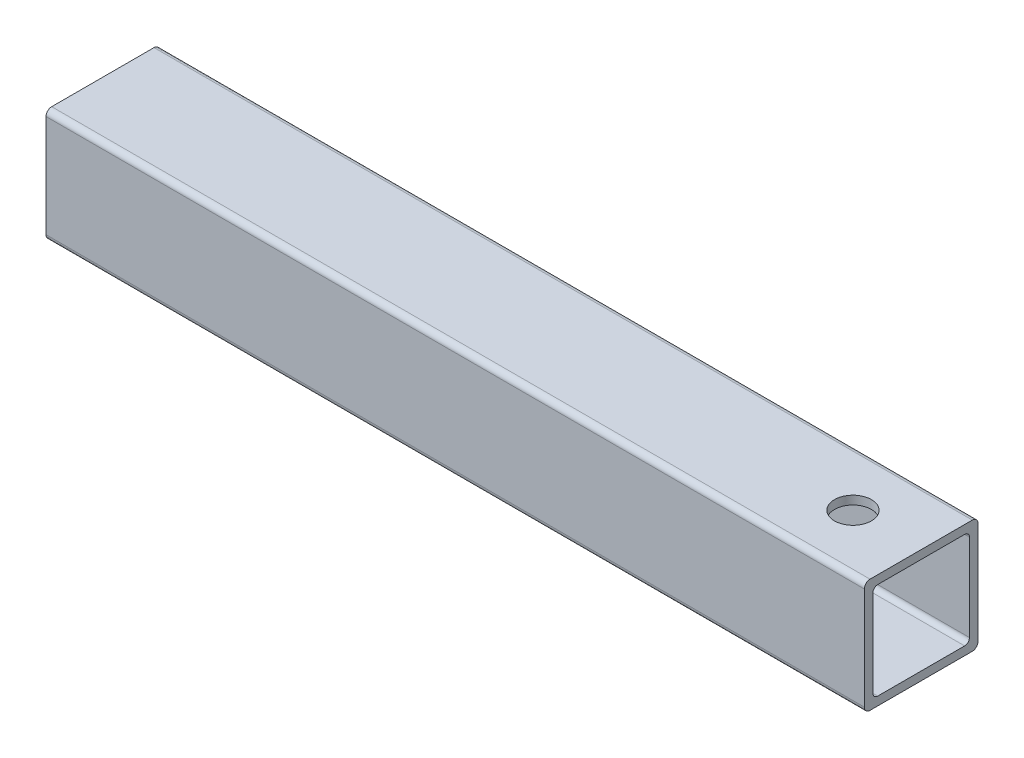
ISO-10303-21;
HEADER;
FILE_DESCRIPTION(('STEP AP214'),'2;1');
FILE_NAME('part.step','',(''),(''),'','','');
FILE_SCHEMA(('AUTOMOTIVE_DESIGN { 1 0 10303 214 1 1 1 1 }'));
ENDSEC;
DATA;
#1=APPLICATION_CONTEXT('core data for automotive mechanical design processes');
#2=APPLICATION_PROTOCOL_DEFINITION('international standard','automotive_design',2000,#1);
#3=PRODUCT_CONTEXT('',#1,'mechanical');
#4=PRODUCT('Part','Part','',(#3));
#5=PRODUCT_RELATED_PRODUCT_CATEGORY('part','',(#4));
#6=PRODUCT_DEFINITION_FORMATION('','',#4);
#7=PRODUCT_DEFINITION_CONTEXT('part definition',#1,'design');
#8=PRODUCT_DEFINITION('design','',#6,#7);
#9=PRODUCT_DEFINITION_SHAPE('','',#8);
#10=(LENGTH_UNIT() NAMED_UNIT(*) SI_UNIT(.MILLI.,.METRE.));
#11=(NAMED_UNIT(*) PLANE_ANGLE_UNIT() SI_UNIT($,.RADIAN.));
#12=(NAMED_UNIT(*) SI_UNIT($,.STERADIAN.) SOLID_ANGLE_UNIT());
#13=UNCERTAINTY_MEASURE_WITH_UNIT(LENGTH_MEASURE(1.E-05),#10,'distance_accuracy_value','');
#14=(GEOMETRIC_REPRESENTATION_CONTEXT(3) GLOBAL_UNCERTAINTY_ASSIGNED_CONTEXT((#13)) GLOBAL_UNIT_ASSIGNED_CONTEXT((#10,
#11,#12)) REPRESENTATION_CONTEXT('',''));
#15=CARTESIAN_POINT('',(0.,0.,0.));
#16=DIRECTION('',(0.,0.,1.));
#17=DIRECTION('',(1.,0.,0.));
#18=AXIS2_PLACEMENT_3D('',#15,#16,#17);
#19=CARTESIAN_POINT('',(457.2,28.575,-28.575));
#20=DIRECTION('',(-1.,0.,0.));
#21=DIRECTION('',(0.,0.,1.));
#22=AXIS2_PLACEMENT_3D('',#19,#20,#21);
#23=CYLINDRICAL_SURFACE('',#22,3.175);
#24=CARTESIAN_POINT('',(0.,28.575,-28.575));
#25=DIRECTION('',(1.,0.,0.));
#26=DIRECTION('',(0.,0.,-1.));
#27=AXIS2_PLACEMENT_3D('',#24,#25,#26);
#28=CIRCLE('',#27,3.175);
#29=CARTESIAN_POINT('',(0.,28.575,-31.75));
#30=VERTEX_POINT('',#29);
#31=CARTESIAN_POINT('',(0.,31.75,-28.575));
#32=VERTEX_POINT('',#31);
#33=EDGE_CURVE('E253',#30,#32,#28,.T.);
#34=ORIENTED_EDGE('',*,*,#33,.T.);
#35=DIRECTION('',(-1.,0.,0.));
#36=VECTOR('',#35,1.);
#37=CARTESIAN_POINT('',(457.2,31.75,-28.575));
#38=LINE('',#37,#36);
#39=CARTESIAN_POINT('',(457.2,31.75,-28.575));
#40=VERTEX_POINT('',#39);
#41=EDGE_CURVE('E12',#40,#32,#38,.T.);
#42=ORIENTED_EDGE('',*,*,#41,.F.);
#43=CARTESIAN_POINT('',(457.2,28.575,-28.575));
#44=DIRECTION('',(1.,0.,0.));
#45=DIRECTION('',(0.,0.,-1.));
#46=AXIS2_PLACEMENT_3D('',#43,#44,#45);
#47=CIRCLE('',#46,3.175);
#48=CARTESIAN_POINT('',(457.2,28.575,-31.75));
#49=VERTEX_POINT('',#48);
#50=EDGE_CURVE('E359',#49,#40,#47,.T.);
#51=ORIENTED_EDGE('',*,*,#50,.F.);
#52=DIRECTION('',(-1.,0.,0.));
#53=VECTOR('',#52,1.);
#54=CARTESIAN_POINT('',(457.2,28.575,-31.75));
#55=LINE('',#54,#53);
#56=EDGE_CURVE('E276',#49,#30,#55,.T.);
#57=ORIENTED_EDGE('',*,*,#56,.T.);
#58=EDGE_LOOP('',(#34,#42,#51,#57));
#59=FACE_BOUND('',#58,.T.);
#60=ADVANCED_FACE('F67',(#59),#23,.T.);
#61=CARTESIAN_POINT('',(457.2,31.75,-28.575));
#62=DIRECTION('',(0.,-1.,0.));
#63=DIRECTION('',(0.,0.,-1.));
#64=AXIS2_PLACEMENT_3D('',#61,#62,#63);
#65=PLANE('',#64);
#66=CARTESIAN_POINT('',(419.1,31.75,0.));
#67=DIRECTION('',(0.,1.,0.));
#68=DIRECTION('',(0.,0.,1.));
#69=AXIS2_PLACEMENT_3D('',#66,#67,#68);
#70=CIRCLE('',#69,10.3251);
#71=CARTESIAN_POINT('',(419.1,31.75,10.3251));
#72=VERTEX_POINT('',#71);
#73=EDGE_CURVE('E561',#72,#72,#70,.T.);
#74=ORIENTED_EDGE('',*,*,#73,.F.);
#75=EDGE_LOOP('',(#74));
#76=FACE_BOUND('',#75,.T.);
#77=DIRECTION('',(0.,0.,1.));
#78=VECTOR('',#77,1.);
#79=CARTESIAN_POINT('',(0.,31.75,-28.575));
#80=LINE('',#79,#78);
#81=CARTESIAN_POINT('',(0.,31.75,28.575));
#82=VERTEX_POINT('',#81);
#83=EDGE_CURVE('E257',#32,#82,#80,.T.);
#84=ORIENTED_EDGE('',*,*,#83,.T.);
#85=DIRECTION('',(-1.,0.,0.));
#86=VECTOR('',#85,1.);
#87=CARTESIAN_POINT('',(457.2,31.75,28.575));
#88=LINE('',#87,#86);
#89=CARTESIAN_POINT('',(457.2,31.75,28.575));
#90=VERTEX_POINT('',#89);
#91=EDGE_CURVE('E78',#90,#82,#88,.T.);
#92=ORIENTED_EDGE('',*,*,#91,.F.);
#93=DIRECTION('',(0.,0.,1.));
#94=VECTOR('',#93,1.);
#95=CARTESIAN_POINT('',(457.2,31.75,-28.575));
#96=LINE('',#95,#94);
#97=EDGE_CURVE('E362',#40,#90,#96,.T.);
#98=ORIENTED_EDGE('',*,*,#97,.F.);
#99=ORIENTED_EDGE('',*,*,#41,.T.);
#100=EDGE_LOOP('',(#84,#92,#98,#99));
#101=FACE_BOUND('',#100,.T.);
#102=ADVANCED_FACE('F401',(#76,#101),#65,.F.);
#103=CARTESIAN_POINT('',(457.2,28.575,28.575));
#104=DIRECTION('',(-1.,0.,0.));
#105=DIRECTION('',(0.,0.,1.));
#106=AXIS2_PLACEMENT_3D('',#103,#104,#105);
#107=CYLINDRICAL_SURFACE('',#106,3.175);
#108=CARTESIAN_POINT('',(0.,28.575,28.575));
#109=DIRECTION('',(1.,0.,0.));
#110=DIRECTION('',(0.,0.,-1.));
#111=AXIS2_PLACEMENT_3D('',#108,#109,#110);
#112=CIRCLE('',#111,3.175);
#113=CARTESIAN_POINT('',(0.,28.575,31.75));
#114=VERTEX_POINT('',#113);
#115=EDGE_CURVE('E260',#82,#114,#112,.T.);
#116=ORIENTED_EDGE('',*,*,#115,.T.);
#117=DIRECTION('',(-1.,0.,0.));
#118=VECTOR('',#117,1.);
#119=CARTESIAN_POINT('',(457.2,28.575,31.75));
#120=LINE('',#119,#118);
#121=CARTESIAN_POINT('',(457.2,28.575,31.75));
#122=VERTEX_POINT('',#121);
#123=EDGE_CURVE('E287',#122,#114,#120,.T.);
#124=ORIENTED_EDGE('',*,*,#123,.F.);
#125=CARTESIAN_POINT('',(457.2,28.575,28.575));
#126=DIRECTION('',(1.,0.,0.));
#127=DIRECTION('',(0.,0.,-1.));
#128=AXIS2_PLACEMENT_3D('',#125,#126,#127);
#129=CIRCLE('',#128,3.175);
#130=EDGE_CURVE('E365',#90,#122,#129,.T.);
#131=ORIENTED_EDGE('',*,*,#130,.F.);
#132=ORIENTED_EDGE('',*,*,#91,.T.);
#133=EDGE_LOOP('',(#116,#124,#131,#132));
#134=FACE_BOUND('',#133,.T.);
#135=ADVANCED_FACE('F406',(#134),#107,.T.);
#136=CARTESIAN_POINT('',(457.2,28.575,31.75));
#137=DIRECTION('',(0.,0.,-1.));
#138=DIRECTION('',(-1.,0.,0.));
#139=AXIS2_PLACEMENT_3D('',#136,#137,#138);
#140=PLANE('',#139);
#141=DIRECTION('',(0.,-1.,0.));
#142=VECTOR('',#141,1.);
#143=CARTESIAN_POINT('',(0.,28.575,31.75));
#144=LINE('',#143,#142);
#145=CARTESIAN_POINT('',(0.,-28.575,31.75));
#146=VERTEX_POINT('',#145);
#147=EDGE_CURVE('E263',#114,#146,#144,.T.);
#148=ORIENTED_EDGE('',*,*,#147,.T.);
#149=DIRECTION('',(-1.,0.,0.));
#150=VECTOR('',#149,1.);
#151=CARTESIAN_POINT('',(457.2,-28.575,31.75));
#152=LINE('',#151,#150);
#153=CARTESIAN_POINT('',(457.2,-28.575,31.75));
#154=VERTEX_POINT('',#153);
#155=EDGE_CURVE('E283',#154,#146,#152,.T.);
#156=ORIENTED_EDGE('',*,*,#155,.F.);
#157=DIRECTION('',(0.,-1.,0.));
#158=VECTOR('',#157,1.);
#159=CARTESIAN_POINT('',(457.2,28.575,31.75));
#160=LINE('',#159,#158);
#161=EDGE_CURVE('E368',#122,#154,#160,.T.);
#162=ORIENTED_EDGE('',*,*,#161,.F.);
#163=ORIENTED_EDGE('',*,*,#123,.T.);
#164=EDGE_LOOP('',(#148,#156,#162,#163));
#165=FACE_BOUND('',#164,.T.);
#166=ADVANCED_FACE('F376',(#165),#140,.F.);
#167=CARTESIAN_POINT('',(457.2,-28.575,28.575));
#168=DIRECTION('',(-1.,0.,0.));
#169=DIRECTION('',(0.,0.,1.));
#170=AXIS2_PLACEMENT_3D('',#167,#168,#169);
#171=CYLINDRICAL_SURFACE('',#170,3.175);
#172=CARTESIAN_POINT('',(0.,-28.575,28.575));
#173=DIRECTION('',(1.,0.,0.));
#174=DIRECTION('',(0.,0.,-1.));
#175=AXIS2_PLACEMENT_3D('',#172,#173,#174);
#176=CIRCLE('',#175,3.175);
#177=CARTESIAN_POINT('',(0.,-31.75,28.575));
#178=VERTEX_POINT('',#177);
#179=EDGE_CURVE('E266',#146,#178,#176,.T.);
#180=ORIENTED_EDGE('',*,*,#179,.T.);
#181=DIRECTION('',(-1.,0.,0.));
#182=VECTOR('',#181,1.);
#183=CARTESIAN_POINT('',(457.2,-31.75,28.575));
#184=LINE('',#183,#182);
#185=CARTESIAN_POINT('',(457.2,-31.75,28.575));
#186=VERTEX_POINT('',#185);
#187=EDGE_CURVE('E209',#186,#178,#184,.T.);
#188=ORIENTED_EDGE('',*,*,#187,.F.);
#189=CARTESIAN_POINT('',(457.2,-28.575,28.575));
#190=DIRECTION('',(1.,0.,0.));
#191=DIRECTION('',(0.,0.,-1.));
#192=AXIS2_PLACEMENT_3D('',#189,#190,#191);
#193=CIRCLE('',#192,3.175);
#194=EDGE_CURVE('E198',#154,#186,#193,.T.);
#195=ORIENTED_EDGE('',*,*,#194,.F.);
#196=ORIENTED_EDGE('',*,*,#155,.T.);
#197=EDGE_LOOP('',(#180,#188,#195,#196));
#198=FACE_BOUND('',#197,.T.);
#199=ADVANCED_FACE('F380',(#198),#171,.T.);
#200=CARTESIAN_POINT('',(457.2,-31.75,-28.575));
#201=DIRECTION('',(0.,1.,0.));
#202=DIRECTION('',(0.,0.,1.));
#203=AXIS2_PLACEMENT_3D('',#200,#201,#202);
#204=PLANE('',#203);
#205=DIRECTION('',(0.,0.,-1.));
#206=VECTOR('',#205,1.);
#207=CARTESIAN_POINT('',(0.,-31.75,-28.575));
#208=LINE('',#207,#206);
#209=CARTESIAN_POINT('',(0.,-31.75,-28.575));
#210=VERTEX_POINT('',#209);
#211=EDGE_CURVE('E207',#178,#210,#208,.T.);
#212=ORIENTED_EDGE('',*,*,#211,.T.);
#213=DIRECTION('',(-1.,0.,0.));
#214=VECTOR('',#213,1.);
#215=CARTESIAN_POINT('',(457.2,-31.75,-28.575));
#216=LINE('',#215,#214);
#217=CARTESIAN_POINT('',(457.2,-31.75,-28.575));
#218=VERTEX_POINT('',#217);
#219=EDGE_CURVE('E204',#218,#210,#216,.T.);
#220=ORIENTED_EDGE('',*,*,#219,.F.);
#221=DIRECTION('',(0.,0.,-1.));
#222=VECTOR('',#221,1.);
#223=CARTESIAN_POINT('',(457.2,-31.75,-28.575));
#224=LINE('',#223,#222);
#225=EDGE_CURVE('E192',#186,#218,#224,.T.);
#226=ORIENTED_EDGE('',*,*,#225,.F.);
#227=ORIENTED_EDGE('',*,*,#187,.T.);
#228=EDGE_LOOP('',(#212,#220,#226,#227));
#229=FACE_BOUND('',#228,.T.);
#230=ADVANCED_FACE('F205',(#229),#204,.F.);
#231=CARTESIAN_POINT('',(457.2,-28.575,-28.575));
#232=DIRECTION('',(-1.,0.,0.));
#233=DIRECTION('',(0.,0.,1.));
#234=AXIS2_PLACEMENT_3D('',#231,#232,#233);
#235=CYLINDRICAL_SURFACE('',#234,3.175);
#236=CARTESIAN_POINT('',(0.,-28.575,-28.575));
#237=DIRECTION('',(1.,0.,0.));
#238=DIRECTION('',(0.,0.,1.));
#239=AXIS2_PLACEMENT_3D('',#236,#237,#238);
#240=CIRCLE('',#239,3.175);
#241=CARTESIAN_POINT('',(0.,-28.575,-31.75));
#242=VERTEX_POINT('',#241);
#243=EDGE_CURVE('E140',#210,#242,#240,.T.);
#244=ORIENTED_EDGE('',*,*,#243,.T.);
#245=DIRECTION('',(-1.,0.,0.));
#246=VECTOR('',#245,1.);
#247=CARTESIAN_POINT('',(457.2,-28.575,-31.75));
#248=LINE('',#247,#246);
#249=CARTESIAN_POINT('',(457.2,-28.575,-31.75));
#250=VERTEX_POINT('',#249);
#251=EDGE_CURVE('E210',#250,#242,#248,.T.);
#252=ORIENTED_EDGE('',*,*,#251,.F.);
#253=CARTESIAN_POINT('',(457.2,-28.575,-28.575));
#254=DIRECTION('',(1.,0.,0.));
#255=DIRECTION('',(0.,0.,1.));
#256=AXIS2_PLACEMENT_3D('',#253,#254,#255);
#257=CIRCLE('',#256,3.175);
#258=EDGE_CURVE('E196',#218,#250,#257,.T.);
#259=ORIENTED_EDGE('',*,*,#258,.F.);
#260=ORIENTED_EDGE('',*,*,#219,.T.);
#261=EDGE_LOOP('',(#244,#252,#259,#260));
#262=FACE_BOUND('',#261,.T.);
#263=ADVANCED_FACE('F212',(#262),#235,.T.);
#264=CARTESIAN_POINT('',(457.2,-24.27732,-24.27732));
#265=DIRECTION('',(-1.,0.,0.));
#266=DIRECTION('',(0.,0.,1.));
#267=AXIS2_PLACEMENT_3D('',#264,#265,#266);
#268=CYLINDRICAL_SURFACE('',#267,2.69748);
#269=CARTESIAN_POINT('',(0.,-24.27732,-24.27732));
#270=DIRECTION('',(1.,0.,0.));
#271=DIRECTION('',(0.,0.,1.));
#272=AXIS2_PLACEMENT_3D('',#269,#270,#271);
#273=CIRCLE('',#272,2.69748);
#274=CARTESIAN_POINT('',(0.,-26.9748,-24.27732));
#275=VERTEX_POINT('',#274);
#276=CARTESIAN_POINT('',(0.,-24.27732,-26.9748));
#277=VERTEX_POINT('',#276);
#278=EDGE_CURVE('E220',#275,#277,#273,.T.);
#279=ORIENTED_EDGE('',*,*,#278,.F.);
#280=DIRECTION('',(-1.,0.,0.));
#281=VECTOR('',#280,1.);
#282=CARTESIAN_POINT('',(457.2,-26.9748,-24.27732));
#283=LINE('',#282,#281);
#284=CARTESIAN_POINT('',(457.2,-26.9748,-24.27732));
#285=VERTEX_POINT('',#284);
#286=EDGE_CURVE('E71',#285,#275,#283,.T.);
#287=ORIENTED_EDGE('',*,*,#286,.F.);
#288=CARTESIAN_POINT('',(457.2,-24.27732,-24.27732));
#289=DIRECTION('',(1.,0.,0.));
#290=DIRECTION('',(0.,0.,1.));
#291=AXIS2_PLACEMENT_3D('',#288,#289,#290);
#292=CIRCLE('',#291,2.69748);
#293=CARTESIAN_POINT('',(457.2,-24.27732,-26.9748));
#294=VERTEX_POINT('',#293);
#295=EDGE_CURVE('E275',#285,#294,#292,.T.);
#296=ORIENTED_EDGE('',*,*,#295,.T.);
#297=DIRECTION('',(-1.,0.,0.));
#298=VECTOR('',#297,1.);
#299=CARTESIAN_POINT('',(457.2,-24.27732,-26.9748));
#300=LINE('',#299,#298);
#301=EDGE_CURVE('E216',#294,#277,#300,.T.);
#302=ORIENTED_EDGE('',*,*,#301,.T.);
#303=EDGE_LOOP('',(#279,#287,#296,#302));
#304=FACE_BOUND('',#303,.T.);
#305=ADVANCED_FACE('F69',(#304),#268,.F.);
#306=CARTESIAN_POINT('',(457.2,-26.9748,24.27732));
#307=DIRECTION('',(0.,1.,0.));
#308=DIRECTION('',(0.,0.,1.));
#309=AXIS2_PLACEMENT_3D('',#306,#307,#308);
#310=PLANE('',#309);
#311=DIRECTION('',(0.,0.,-1.));
#312=VECTOR('',#311,1.);
#313=CARTESIAN_POINT('',(0.,-26.9748,24.27732));
#314=LINE('',#313,#312);
#315=CARTESIAN_POINT('',(0.,-26.9748,24.27732));
#316=VERTEX_POINT('',#315);
#317=EDGE_CURVE('E224',#316,#275,#314,.T.);
#318=ORIENTED_EDGE('',*,*,#317,.F.);
#319=DIRECTION('',(-1.,0.,0.));
#320=VECTOR('',#319,1.);
#321=CARTESIAN_POINT('',(457.2,-26.9748,24.27732));
#322=LINE('',#321,#320);
#323=CARTESIAN_POINT('',(457.2,-26.9748,24.27732));
#324=VERTEX_POINT('',#323);
#325=EDGE_CURVE('E310',#324,#316,#322,.T.);
#326=ORIENTED_EDGE('',*,*,#325,.F.);
#327=DIRECTION('',(0.,0.,-1.));
#328=VECTOR('',#327,1.);
#329=CARTESIAN_POINT('',(457.2,-26.9748,24.27732));
#330=LINE('',#329,#328);
#331=EDGE_CURVE('E321',#324,#285,#330,.T.);
#332=ORIENTED_EDGE('',*,*,#331,.T.);
#333=ORIENTED_EDGE('',*,*,#286,.T.);
#334=EDGE_LOOP('',(#318,#326,#332,#333));
#335=FACE_BOUND('',#334,.T.);
#336=ADVANCED_FACE('F319',(#335),#310,.T.);
#337=CARTESIAN_POINT('',(457.2,-24.27732,24.27732));
#338=DIRECTION('',(-1.,0.,0.));
#339=DIRECTION('',(0.,0.,1.));
#340=AXIS2_PLACEMENT_3D('',#337,#338,#339);
#341=CYLINDRICAL_SURFACE('',#340,2.69748000000001);
#342=CARTESIAN_POINT('',(0.,-24.27732,24.27732));
#343=DIRECTION('',(1.,0.,0.));
#344=DIRECTION('',(0.,0.,-1.));
#345=AXIS2_PLACEMENT_3D('',#342,#343,#344);
#346=CIRCLE('',#345,2.69748000000001);
#347=CARTESIAN_POINT('',(0.,-24.27732,26.9748));
#348=VERTEX_POINT('',#347);
#349=EDGE_CURVE('E229',#348,#316,#346,.T.);
#350=ORIENTED_EDGE('',*,*,#349,.F.);
#351=DIRECTION('',(-1.,0.,0.));
#352=VECTOR('',#351,1.);
#353=CARTESIAN_POINT('',(457.2,-24.27732,26.9748));
#354=LINE('',#353,#352);
#355=CARTESIAN_POINT('',(457.2,-24.27732,26.9748));
#356=VERTEX_POINT('',#355);
#357=EDGE_CURVE('E308',#356,#348,#354,.T.);
#358=ORIENTED_EDGE('',*,*,#357,.F.);
#359=CARTESIAN_POINT('',(457.2,-24.27732,24.27732));
#360=DIRECTION('',(1.,0.,0.));
#361=DIRECTION('',(0.,0.,-1.));
#362=AXIS2_PLACEMENT_3D('',#359,#360,#361);
#363=CIRCLE('',#362,2.69748000000001);
#364=EDGE_CURVE('E329',#356,#324,#363,.T.);
#365=ORIENTED_EDGE('',*,*,#364,.T.);
#366=ORIENTED_EDGE('',*,*,#325,.T.);
#367=EDGE_LOOP('',(#350,#358,#365,#366));
#368=FACE_BOUND('',#367,.T.);
#369=ADVANCED_FACE('F327',(#368),#341,.F.);
#370=CARTESIAN_POINT('',(457.2,24.27732,26.9748));
#371=DIRECTION('',(0.,0.,-1.));
#372=DIRECTION('',(0.,1.,0.));
#373=AXIS2_PLACEMENT_3D('',#370,#371,#372);
#374=PLANE('',#373);
#375=DIRECTION('',(0.,-1.,0.));
#376=VECTOR('',#375,1.);
#377=CARTESIAN_POINT('',(0.,24.27732,26.9748));
#378=LINE('',#377,#376);
#379=CARTESIAN_POINT('',(0.,24.27732,26.9748));
#380=VERTEX_POINT('',#379);
#381=EDGE_CURVE('E233',#380,#348,#378,.T.);
#382=ORIENTED_EDGE('',*,*,#381,.F.);
#383=DIRECTION('',(-1.,0.,0.));
#384=VECTOR('',#383,1.);
#385=CARTESIAN_POINT('',(457.2,24.27732,26.9748));
#386=LINE('',#385,#384);
#387=CARTESIAN_POINT('',(457.2,24.27732,26.9748));
#388=VERTEX_POINT('',#387);
#389=EDGE_CURVE('E305',#388,#380,#386,.T.);
#390=ORIENTED_EDGE('',*,*,#389,.F.);
#391=DIRECTION('',(0.,-1.,0.));
#392=VECTOR('',#391,1.);
#393=CARTESIAN_POINT('',(457.2,24.27732,26.9748));
#394=LINE('',#393,#392);
#395=EDGE_CURVE('E335',#388,#356,#394,.T.);
#396=ORIENTED_EDGE('',*,*,#395,.T.);
#397=ORIENTED_EDGE('',*,*,#357,.T.);
#398=EDGE_LOOP('',(#382,#390,#396,#397));
#399=FACE_BOUND('',#398,.T.);
#400=ADVANCED_FACE('F339',(#399),#374,.T.);
#401=CARTESIAN_POINT('',(457.2,24.27732,24.27732));
#402=DIRECTION('',(-1.,0.,0.));
#403=DIRECTION('',(0.,0.,1.));
#404=AXIS2_PLACEMENT_3D('',#401,#402,#403);
#405=CYLINDRICAL_SURFACE('',#404,2.69748);
#406=CARTESIAN_POINT('',(0.,24.27732,24.27732));
#407=DIRECTION('',(1.,0.,0.));
#408=DIRECTION('',(0.,0.,1.));
#409=AXIS2_PLACEMENT_3D('',#406,#407,#408);
#410=CIRCLE('',#409,2.69748);
#411=CARTESIAN_POINT('',(0.,26.9748,24.27732));
#412=VERTEX_POINT('',#411);
#413=EDGE_CURVE('E237',#412,#380,#410,.T.);
#414=ORIENTED_EDGE('',*,*,#413,.F.);
#415=DIRECTION('',(-1.,0.,0.));
#416=VECTOR('',#415,1.);
#417=CARTESIAN_POINT('',(457.2,26.9748,24.27732));
#418=LINE('',#417,#416);
#419=CARTESIAN_POINT('',(457.2,26.9748,24.27732));
#420=VERTEX_POINT('',#419);
#421=EDGE_CURVE('E302',#420,#412,#418,.T.);
#422=ORIENTED_EDGE('',*,*,#421,.F.);
#423=CARTESIAN_POINT('',(457.2,24.27732,24.27732));
#424=DIRECTION('',(1.,0.,0.));
#425=DIRECTION('',(0.,0.,1.));
#426=AXIS2_PLACEMENT_3D('',#423,#424,#425);
#427=CIRCLE('',#426,2.69748);
#428=EDGE_CURVE('E341',#420,#388,#427,.T.);
#429=ORIENTED_EDGE('',*,*,#428,.T.);
#430=ORIENTED_EDGE('',*,*,#389,.T.);
#431=EDGE_LOOP('',(#414,#422,#429,#430));
#432=FACE_BOUND('',#431,.T.);
#433=ADVANCED_FACE('F417',(#432),#405,.F.);
#434=CARTESIAN_POINT('',(457.2,26.9748,24.27732));
#435=DIRECTION('',(0.,-1.,0.));
#436=DIRECTION('',(0.,0.,-1.));
#437=AXIS2_PLACEMENT_3D('',#434,#435,#436);
#438=PLANE('',#437);
#439=CARTESIAN_POINT('',(419.1,26.9748,0.));
#440=DIRECTION('',(0.,-1.,0.));
#441=DIRECTION('',(0.,0.,-1.));
#442=AXIS2_PLACEMENT_3D('',#439,#440,#441);
#443=CIRCLE('',#442,10.3251);
#444=CARTESIAN_POINT('',(419.1,26.9748,-10.3251));
#445=VERTEX_POINT('',#444);
#446=EDGE_CURVE('E225',#445,#445,#443,.F.);
#447=ORIENTED_EDGE('',*,*,#446,.T.);
#448=EDGE_LOOP('',(#447));
#449=FACE_BOUND('',#448,.T.);
#450=DIRECTION('',(0.,0.,1.));
#451=VECTOR('',#450,1.);
#452=CARTESIAN_POINT('',(0.,26.9748,24.27732));
#453=LINE('',#452,#451);
#454=CARTESIAN_POINT('',(0.,26.9748,-24.27732));
#455=VERTEX_POINT('',#454);
#456=EDGE_CURVE('E241',#455,#412,#453,.T.);
#457=ORIENTED_EDGE('',*,*,#456,.F.);
#458=DIRECTION('',(-1.,0.,0.));
#459=VECTOR('',#458,1.);
#460=CARTESIAN_POINT('',(457.2,26.9748,-24.27732));
#461=LINE('',#460,#459);
#462=CARTESIAN_POINT('',(457.2,26.9748,-24.27732));
#463=VERTEX_POINT('',#462);
#464=EDGE_CURVE('E299',#463,#455,#461,.T.);
#465=ORIENTED_EDGE('',*,*,#464,.F.);
#466=DIRECTION('',(0.,0.,1.));
#467=VECTOR('',#466,1.);
#468=CARTESIAN_POINT('',(457.2,26.9748,24.27732));
#469=LINE('',#468,#467);
#470=EDGE_CURVE('E344',#463,#420,#469,.T.);
#471=ORIENTED_EDGE('',*,*,#470,.T.);
#472=ORIENTED_EDGE('',*,*,#421,.T.);
#473=EDGE_LOOP('',(#457,#465,#471,#472));
#474=FACE_BOUND('',#473,.T.);
#475=ADVANCED_FACE('F413',(#449,#474),#438,.T.);
#476=CARTESIAN_POINT('',(457.2,24.27732,-24.27732));
#477=DIRECTION('',(-1.,0.,0.));
#478=DIRECTION('',(0.,0.,1.));
#479=AXIS2_PLACEMENT_3D('',#476,#477,#478);
#480=CYLINDRICAL_SURFACE('',#479,2.69748);
#481=CARTESIAN_POINT('',(0.,24.27732,-24.27732));
#482=DIRECTION('',(1.,0.,0.));
#483=DIRECTION('',(0.,0.,1.));
#484=AXIS2_PLACEMENT_3D('',#481,#482,#483);
#485=CIRCLE('',#484,2.69748);
#486=CARTESIAN_POINT('',(0.,24.27732,-26.9748));
#487=VERTEX_POINT('',#486);
#488=EDGE_CURVE('E245',#487,#455,#485,.T.);
#489=ORIENTED_EDGE('',*,*,#488,.F.);
#490=DIRECTION('',(-1.,0.,0.));
#491=VECTOR('',#490,1.);
#492=CARTESIAN_POINT('',(457.2,24.27732,-26.9748));
#493=LINE('',#492,#491);
#494=CARTESIAN_POINT('',(457.2,24.27732,-26.9748));
#495=VERTEX_POINT('',#494);
#496=EDGE_CURVE('E296',#495,#487,#493,.T.);
#497=ORIENTED_EDGE('',*,*,#496,.F.);
#498=CARTESIAN_POINT('',(457.2,24.27732,-24.27732));
#499=DIRECTION('',(1.,0.,0.));
#500=DIRECTION('',(0.,0.,1.));
#501=AXIS2_PLACEMENT_3D('',#498,#499,#500);
#502=CIRCLE('',#501,2.69748);
#503=EDGE_CURVE('E351',#495,#463,#502,.T.);
#504=ORIENTED_EDGE('',*,*,#503,.T.);
#505=ORIENTED_EDGE('',*,*,#464,.T.);
#506=EDGE_LOOP('',(#489,#497,#504,#505));
#507=FACE_BOUND('',#506,.T.);
#508=ADVANCED_FACE('F395',(#507),#480,.F.);
#509=CARTESIAN_POINT('',(457.2,24.27732,-26.9748));
#510=DIRECTION('',(0.,0.,1.));
#511=DIRECTION('',(0.,-1.,0.));
#512=AXIS2_PLACEMENT_3D('',#509,#510,#511);
#513=PLANE('',#512);
#514=DIRECTION('',(0.,1.,0.));
#515=VECTOR('',#514,1.);
#516=CARTESIAN_POINT('',(0.,24.27732,-26.9748));
#517=LINE('',#516,#515);
#518=EDGE_CURVE('E249',#277,#487,#517,.T.);
#519=ORIENTED_EDGE('',*,*,#518,.F.);
#520=ORIENTED_EDGE('',*,*,#301,.F.);
#521=DIRECTION('',(0.,1.,0.));
#522=VECTOR('',#521,1.);
#523=CARTESIAN_POINT('',(457.2,24.27732,-26.9748));
#524=LINE('',#523,#522);
#525=EDGE_CURVE('E355',#294,#495,#524,.T.);
#526=ORIENTED_EDGE('',*,*,#525,.T.);
#527=ORIENTED_EDGE('',*,*,#496,.T.);
#528=EDGE_LOOP('',(#519,#520,#526,#527));
#529=FACE_BOUND('',#528,.T.);
#530=ADVANCED_FACE('F388',(#529),#513,.T.);
#531=CARTESIAN_POINT('',(457.2,28.575,-31.75));
#532=DIRECTION('',(0.,0.,1.));
#533=DIRECTION('',(1.,0.,0.));
#534=AXIS2_PLACEMENT_3D('',#531,#532,#533);
#535=PLANE('',#534);
#536=DIRECTION('',(0.,1.,0.));
#537=VECTOR('',#536,1.);
#538=CARTESIAN_POINT('',(0.,28.575,-31.75));
#539=LINE('',#538,#537);
#540=EDGE_CURVE('E146',#242,#30,#539,.T.);
#541=ORIENTED_EDGE('',*,*,#540,.T.);
#542=ORIENTED_EDGE('',*,*,#56,.F.);
#543=DIRECTION('',(0.,1.,0.));
#544=VECTOR('',#543,1.);
#545=CARTESIAN_POINT('',(457.2,28.575,-31.75));
#546=LINE('',#545,#544);
#547=EDGE_CURVE('E87',#250,#49,#546,.T.);
#548=ORIENTED_EDGE('',*,*,#547,.F.);
#549=ORIENTED_EDGE('',*,*,#251,.T.);
#550=EDGE_LOOP('',(#541,#542,#548,#549));
#551=FACE_BOUND('',#550,.T.);
#552=ADVANCED_FACE('F386',(#551),#535,.F.);
#553=CARTESIAN_POINT('',(457.2,28.575,-28.575));
#554=DIRECTION('',(1.,0.,0.));
#555=DIRECTION('',(0.,0.,-1.));
#556=AXIS2_PLACEMENT_3D('',#553,#554,#555);
#557=PLANE('',#556);
#558=ORIENTED_EDGE('',*,*,#295,.F.);
#559=ORIENTED_EDGE('',*,*,#331,.F.);
#560=ORIENTED_EDGE('',*,*,#364,.F.);
#561=ORIENTED_EDGE('',*,*,#395,.F.);
#562=ORIENTED_EDGE('',*,*,#428,.F.);
#563=ORIENTED_EDGE('',*,*,#470,.F.);
#564=ORIENTED_EDGE('',*,*,#503,.F.);
#565=ORIENTED_EDGE('',*,*,#525,.F.);
#566=EDGE_LOOP('',(#558,#559,#560,#561,#562,#563,#564,#565));
#567=FACE_BOUND('',#566,.T.);
#568=ORIENTED_EDGE('',*,*,#50,.T.);
#569=ORIENTED_EDGE('',*,*,#97,.T.);
#570=ORIENTED_EDGE('',*,*,#130,.T.);
#571=ORIENTED_EDGE('',*,*,#161,.T.);
#572=ORIENTED_EDGE('',*,*,#194,.T.);
#573=ORIENTED_EDGE('',*,*,#225,.T.);
#574=ORIENTED_EDGE('',*,*,#258,.T.);
#575=ORIENTED_EDGE('',*,*,#547,.T.);
#576=EDGE_LOOP('',(#568,#569,#570,#571,#572,#573,#574,#575));
#577=FACE_BOUND('',#576,.T.);
#578=ADVANCED_FACE('F194',(#567,#577),#557,.T.);
#579=CARTESIAN_POINT('',(0.,28.575,-28.575));
#580=DIRECTION('',(1.,0.,0.));
#581=DIRECTION('',(0.,0.,-1.));
#582=AXIS2_PLACEMENT_3D('',#579,#580,#581);
#583=PLANE('',#582);
#584=ORIENTED_EDGE('',*,*,#278,.T.);
#585=ORIENTED_EDGE('',*,*,#518,.T.);
#586=ORIENTED_EDGE('',*,*,#488,.T.);
#587=ORIENTED_EDGE('',*,*,#456,.T.);
#588=ORIENTED_EDGE('',*,*,#413,.T.);
#589=ORIENTED_EDGE('',*,*,#381,.T.);
#590=ORIENTED_EDGE('',*,*,#349,.T.);
#591=ORIENTED_EDGE('',*,*,#317,.T.);
#592=EDGE_LOOP('',(#584,#585,#586,#587,#588,#589,#590,#591));
#593=FACE_BOUND('',#592,.T.);
#594=ORIENTED_EDGE('',*,*,#33,.F.);
#595=ORIENTED_EDGE('',*,*,#540,.F.);
#596=ORIENTED_EDGE('',*,*,#243,.F.);
#597=ORIENTED_EDGE('',*,*,#211,.F.);
#598=ORIENTED_EDGE('',*,*,#179,.F.);
#599=ORIENTED_EDGE('',*,*,#147,.F.);
#600=ORIENTED_EDGE('',*,*,#115,.F.);
#601=ORIENTED_EDGE('',*,*,#83,.F.);
#602=EDGE_LOOP('',(#594,#595,#596,#597,#598,#599,#600,#601));
#603=FACE_BOUND('',#602,.T.);
#604=ADVANCED_FACE('F324',(#593,#603),#583,.F.);
#605=CARTESIAN_POINT('',(419.1,-2.22899290571681,0.));
#606=DIRECTION('',(0.,1.,0.));
#607=DIRECTION('',(0.,0.,1.));
#608=AXIS2_PLACEMENT_3D('',#605,#606,#607);
#609=CYLINDRICAL_SURFACE('',#608,10.3251);
#610=ORIENTED_EDGE('',*,*,#73,.T.);
#611=EDGE_LOOP('',(#610));
#612=FACE_BOUND('',#611,.T.);
#613=ORIENTED_EDGE('',*,*,#446,.F.);
#614=EDGE_LOOP('',(#613));
#615=FACE_BOUND('',#614,.T.);
#616=ADVANCED_FACE('F532',(#612,#615),#609,.F.);
#617=CLOSED_SHELL('',(#60,#102,#135,#166,#199,#230,#263,#305,#336,#369,#400,#433,#475,#508,#530,
#552,#578,#604,#616));
#618=MANIFOLD_SOLID_BREP('B2',#617);
#619=ADVANCED_BREP_SHAPE_REPRESENTATION('',(#18,#618),#14);
#620=SHAPE_DEFINITION_REPRESENTATION(#9,#619);
ENDSEC;
END-ISO-10303-21;
